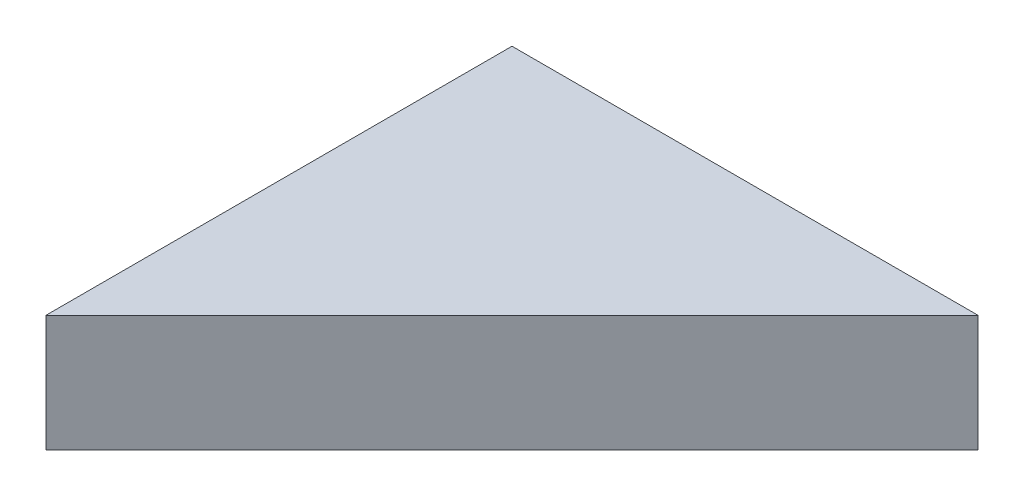
ISO-10303-21;
HEADER;
FILE_DESCRIPTION(('STEP AP214'),'2;1');
FILE_NAME('part.step','',(''),(''),'','','');
FILE_SCHEMA(('AUTOMOTIVE_DESIGN { 1 0 10303 214 1 1 1 1 }'));
ENDSEC;
DATA;
#1=APPLICATION_CONTEXT('core data for automotive mechanical design processes');
#2=APPLICATION_PROTOCOL_DEFINITION('international standard','automotive_design',2000,#1);
#3=PRODUCT_CONTEXT('',#1,'mechanical');
#4=PRODUCT('Part','Part','',(#3));
#5=PRODUCT_RELATED_PRODUCT_CATEGORY('part','',(#4));
#6=PRODUCT_DEFINITION_FORMATION('','',#4);
#7=PRODUCT_DEFINITION_CONTEXT('part definition',#1,'design');
#8=PRODUCT_DEFINITION('design','',#6,#7);
#9=PRODUCT_DEFINITION_SHAPE('','',#8);
#10=(LENGTH_UNIT() NAMED_UNIT(*) SI_UNIT(.MILLI.,.METRE.));
#11=(NAMED_UNIT(*) PLANE_ANGLE_UNIT() SI_UNIT($,.RADIAN.));
#12=(NAMED_UNIT(*) SI_UNIT($,.STERADIAN.) SOLID_ANGLE_UNIT());
#13=UNCERTAINTY_MEASURE_WITH_UNIT(LENGTH_MEASURE(1.E-05),#10,'distance_accuracy_value','');
#14=(GEOMETRIC_REPRESENTATION_CONTEXT(3) GLOBAL_UNCERTAINTY_ASSIGNED_CONTEXT((#13)) GLOBAL_UNIT_ASSIGNED_CONTEXT((#10,
#11,#12)) REPRESENTATION_CONTEXT('',''));
#15=CARTESIAN_POINT('',(0.,0.,0.));
#16=DIRECTION('',(0.,0.,1.));
#17=DIRECTION('',(1.,0.,0.));
#18=AXIS2_PLACEMENT_3D('',#15,#16,#17);
#19=CARTESIAN_POINT('',(0.,15.,-60.));
#20=DIRECTION('',(0.,0.,-1.));
#21=DIRECTION('',(-1.,0.,0.));
#22=AXIS2_PLACEMENT_3D('',#19,#20,#21);
#23=PLANE('',#22);
#24=DIRECTION('',(1.,0.,0.));
#25=VECTOR('',#24,1.);
#26=CARTESIAN_POINT('',(0.,0.,-60.));
#27=LINE('',#26,#25);
#28=CARTESIAN_POINT('',(0.,0.,-60.));
#29=VERTEX_POINT('',#28);
#30=CARTESIAN_POINT('',(60.,0.,-60.));
#31=VERTEX_POINT('',#30);
#32=EDGE_CURVE('E85',#29,#31,#27,.T.);
#33=ORIENTED_EDGE('',*,*,#32,.F.);
#34=DIRECTION('',(0.,-1.,0.));
#35=VECTOR('',#34,1.);
#36=CARTESIAN_POINT('',(0.,15.,-60.));
#37=LINE('',#36,#35);
#38=CARTESIAN_POINT('',(0.,15.,-60.));
#39=VERTEX_POINT('',#38);
#40=EDGE_CURVE('E11',#39,#29,#37,.T.);
#41=ORIENTED_EDGE('',*,*,#40,.F.);
#42=DIRECTION('',(1.,0.,0.));
#43=VECTOR('',#42,1.);
#44=CARTESIAN_POINT('',(0.,15.,-60.));
#45=LINE('',#44,#43);
#46=CARTESIAN_POINT('',(60.,15.,-60.));
#47=VERTEX_POINT('',#46);
#48=EDGE_CURVE('E77',#39,#47,#45,.T.);
#49=ORIENTED_EDGE('',*,*,#48,.T.);
#50=DIRECTION('',(0.,-1.,0.));
#51=VECTOR('',#50,1.);
#52=CARTESIAN_POINT('',(60.,15.,-60.));
#53=LINE('',#52,#51);
#54=EDGE_CURVE('E36',#47,#31,#53,.T.);
#55=ORIENTED_EDGE('',*,*,#54,.T.);
#56=EDGE_LOOP('',(#33,#41,#49,#55));
#57=FACE_BOUND('',#56,.T.);
#58=ADVANCED_FACE('F33',(#57),#23,.T.);
#59=CARTESIAN_POINT('',(0.,15.,0.));
#60=DIRECTION('',(-1.,0.,0.));
#61=DIRECTION('',(0.,0.,1.));
#62=AXIS2_PLACEMENT_3D('',#59,#60,#61);
#63=PLANE('',#62);
#64=DIRECTION('',(0.,0.,-1.));
#65=VECTOR('',#64,1.);
#66=CARTESIAN_POINT('',(0.,0.,0.));
#67=LINE('',#66,#65);
#68=CARTESIAN_POINT('',(0.,0.,0.));
#69=VERTEX_POINT('',#68);
#70=EDGE_CURVE('E79',#69,#29,#67,.T.);
#71=ORIENTED_EDGE('',*,*,#70,.F.);
#72=DIRECTION('',(0.,-1.,0.));
#73=VECTOR('',#72,1.);
#74=CARTESIAN_POINT('',(0.,15.,0.));
#75=LINE('',#74,#73);
#76=CARTESIAN_POINT('',(0.,15.,0.));
#77=VERTEX_POINT('',#76);
#78=EDGE_CURVE('E42',#77,#69,#75,.T.);
#79=ORIENTED_EDGE('',*,*,#78,.F.);
#80=DIRECTION('',(0.,0.,-1.));
#81=VECTOR('',#80,1.);
#82=CARTESIAN_POINT('',(0.,15.,0.));
#83=LINE('',#82,#81);
#84=EDGE_CURVE('E74',#77,#39,#83,.T.);
#85=ORIENTED_EDGE('',*,*,#84,.T.);
#86=ORIENTED_EDGE('',*,*,#40,.T.);
#87=EDGE_LOOP('',(#71,#79,#85,#86));
#88=FACE_BOUND('',#87,.T.);
#89=ADVANCED_FACE('F89',(#88),#63,.T.);
#90=CARTESIAN_POINT('',(60.,15.,-60.));
#91=DIRECTION('',(0.707106781186547,0.,0.707106781186547));
#92=DIRECTION('',(0.707106781186548,0.,-0.707106781186548));
#93=AXIS2_PLACEMENT_3D('',#90,#91,#92);
#94=PLANE('',#93);
#95=DIRECTION('',(-0.707106781186547,0.,0.707106781186547));
#96=VECTOR('',#95,1.);
#97=CARTESIAN_POINT('',(60.,0.,-60.));
#98=LINE('',#97,#96);
#99=EDGE_CURVE('E72',#31,#69,#98,.T.);
#100=ORIENTED_EDGE('',*,*,#99,.F.);
#101=ORIENTED_EDGE('',*,*,#54,.F.);
#102=DIRECTION('',(-0.707106781186547,0.,0.707106781186547));
#103=VECTOR('',#102,1.);
#104=CARTESIAN_POINT('',(60.,15.,-60.));
#105=LINE('',#104,#103);
#106=EDGE_CURVE('E70',#47,#77,#105,.T.);
#107=ORIENTED_EDGE('',*,*,#106,.T.);
#108=ORIENTED_EDGE('',*,*,#78,.T.);
#109=EDGE_LOOP('',(#100,#101,#107,#108));
#110=FACE_BOUND('',#109,.T.);
#111=ADVANCED_FACE('F69',(#110),#94,.T.);
#112=CARTESIAN_POINT('',(0.,15.,0.));
#113=DIRECTION('',(0.,1.,0.));
#114=DIRECTION('',(0.,0.,1.));
#115=AXIS2_PLACEMENT_3D('',#112,#113,#114);
#116=PLANE('',#115);
#117=ORIENTED_EDGE('',*,*,#48,.F.);
#118=ORIENTED_EDGE('',*,*,#84,.F.);
#119=ORIENTED_EDGE('',*,*,#106,.F.);
#120=EDGE_LOOP('',(#117,#118,#119));
#121=FACE_BOUND('',#120,.T.);
#122=ADVANCED_FACE('F76',(#121),#116,.T.);
#123=CARTESIAN_POINT('',(0.,0.,0.));
#124=DIRECTION('',(0.,1.,0.));
#125=DIRECTION('',(0.,0.,1.));
#126=AXIS2_PLACEMENT_3D('',#123,#124,#125);
#127=PLANE('',#126);
#128=ORIENTED_EDGE('',*,*,#32,.T.);
#129=ORIENTED_EDGE('',*,*,#99,.T.);
#130=ORIENTED_EDGE('',*,*,#70,.T.);
#131=EDGE_LOOP('',(#128,#129,#130));
#132=FACE_BOUND('',#131,.T.);
#133=ADVANCED_FACE('F88',(#132),#127,.F.);
#134=CLOSED_SHELL('',(#58,#89,#111,#122,#133));
#135=MANIFOLD_SOLID_BREP('B2',#134);
#136=ADVANCED_BREP_SHAPE_REPRESENTATION('',(#18,#135),#14);
#137=SHAPE_DEFINITION_REPRESENTATION(#9,#136);
ENDSEC;
END-ISO-10303-21;
